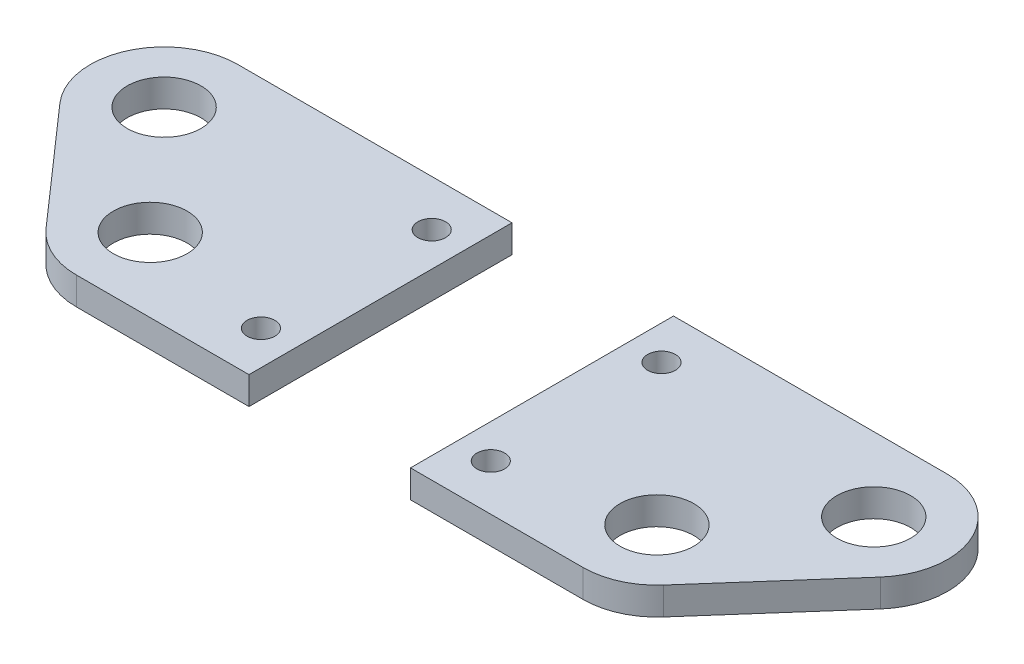
ISO-10303-21;
HEADER;
FILE_DESCRIPTION(('STEP AP214'),'2;1');
FILE_NAME('part.step','',(''),(''),'','','');
FILE_SCHEMA(('AUTOMOTIVE_DESIGN { 1 0 10303 214 1 1 1 1 }'));
ENDSEC;
DATA;
#1=APPLICATION_CONTEXT('core data for automotive mechanical design processes');
#2=APPLICATION_PROTOCOL_DEFINITION('international standard','automotive_design',2000,#1);
#3=PRODUCT_CONTEXT('',#1,'mechanical');
#4=PRODUCT('Part','Part','',(#3));
#5=PRODUCT_RELATED_PRODUCT_CATEGORY('part','',(#4));
#6=PRODUCT_DEFINITION_FORMATION('','',#4);
#7=PRODUCT_DEFINITION_CONTEXT('part definition',#1,'design');
#8=PRODUCT_DEFINITION('design','',#6,#7);
#9=PRODUCT_DEFINITION_SHAPE('','',#8);
#10=(LENGTH_UNIT() NAMED_UNIT(*) SI_UNIT(.MILLI.,.METRE.));
#11=(NAMED_UNIT(*) PLANE_ANGLE_UNIT() SI_UNIT($,.RADIAN.));
#12=(NAMED_UNIT(*) SI_UNIT($,.STERADIAN.) SOLID_ANGLE_UNIT());
#13=UNCERTAINTY_MEASURE_WITH_UNIT(LENGTH_MEASURE(1.E-05),#10,'distance_accuracy_value','');
#14=(GEOMETRIC_REPRESENTATION_CONTEXT(3) GLOBAL_UNCERTAINTY_ASSIGNED_CONTEXT((#13)) GLOBAL_UNIT_ASSIGNED_CONTEXT((#10,
#11,#12)) REPRESENTATION_CONTEXT('',''));
#15=CARTESIAN_POINT('',(0.,0.,0.));
#16=DIRECTION('',(0.,0.,1.));
#17=DIRECTION('',(1.,0.,0.));
#18=AXIS2_PLACEMENT_3D('',#15,#16,#17);
#19=CARTESIAN_POINT('',(27.45,3.,6.24999999999997));
#20=DIRECTION('',(0.,-1.,0.));
#21=DIRECTION('',(0.,0.,-1.));
#22=AXIS2_PLACEMENT_3D('',#19,#20,#21);
#23=CYLINDRICAL_SURFACE('',#22,8.);
#24=CARTESIAN_POINT('',(27.45,0.,6.24999999999997));
#25=DIRECTION('',(0.,1.,0.));
#26=DIRECTION('',(0.,0.,1.));
#27=AXIS2_PLACEMENT_3D('',#24,#25,#26);
#28=CIRCLE('',#27,8.);
#29=CARTESIAN_POINT('',(33.4557081353821,0.,11.5350231591362));
#30=VERTEX_POINT('',#29);
#31=CARTESIAN_POINT('',(27.45,0.,14.25));
#32=VERTEX_POINT('',#31);
#33=EDGE_CURVE('E143',#30,#32,#28,.F.);
#34=ORIENTED_EDGE('',*,*,#33,.F.);
#35=DIRECTION('',(0.,-1.,0.));
#36=VECTOR('',#35,1.);
#37=CARTESIAN_POINT('',(33.4557081353821,3.,11.5350231591362));
#38=LINE('',#37,#36);
#39=CARTESIAN_POINT('',(33.4557081353821,3.,11.5350231591362));
#40=VERTEX_POINT('',#39);
#41=EDGE_CURVE('E12',#40,#30,#38,.T.);
#42=ORIENTED_EDGE('',*,*,#41,.F.);
#43=CARTESIAN_POINT('',(27.45,3.,6.24999999999997));
#44=DIRECTION('',(0.,1.,0.));
#45=DIRECTION('',(0.,0.,1.));
#46=AXIS2_PLACEMENT_3D('',#43,#44,#45);
#47=CIRCLE('',#46,8.);
#48=CARTESIAN_POINT('',(27.45,3.,14.25));
#49=VERTEX_POINT('',#48);
#50=EDGE_CURVE('E350',#40,#49,#47,.F.);
#51=ORIENTED_EDGE('',*,*,#50,.T.);
#52=DIRECTION('',(0.,-1.,0.));
#53=VECTOR('',#52,1.);
#54=CARTESIAN_POINT('',(27.45,3.,14.25));
#55=LINE('',#54,#53);
#56=EDGE_CURVE('E65',#49,#32,#55,.T.);
#57=ORIENTED_EDGE('',*,*,#56,.T.);
#58=EDGE_LOOP('',(#34,#42,#51,#57));
#59=FACE_BOUND('',#58,.T.);
#60=ADVANCED_FACE('F48',(#59),#23,.T.);
#61=CARTESIAN_POINT('',(24.575365484345,3.,21.6263216262237));
#62=DIRECTION('',(-0.750713516922754,0.,-0.660627894892026));
#63=DIRECTION('',(-0.660627894892026,0.,0.750713516922755));
#64=AXIS2_PLACEMENT_3D('',#61,#62,#63);
#65=PLANE('',#64);
#66=DIRECTION('',(0.660627894892026,0.,-0.750713516922754));
#67=VECTOR('',#66,1.);
#68=CARTESIAN_POINT('',(24.575365484345,0.,21.6263216262237));
#69=LINE('',#68,#67);
#70=CARTESIAN_POINT('',(44.4557081353821,0.,-0.964976840863798));
#71=VERTEX_POINT('',#70);
#72=EDGE_CURVE('E140',#30,#71,#69,.T.);
#73=ORIENTED_EDGE('',*,*,#72,.T.);
#74=DIRECTION('',(0.,-1.,0.));
#75=VECTOR('',#74,1.);
#76=CARTESIAN_POINT('',(44.4557081353821,3.,-0.964976840863798));
#77=LINE('',#76,#75);
#78=CARTESIAN_POINT('',(44.4557081353821,3.,-0.964976840863798));
#79=VERTEX_POINT('',#78);
#80=EDGE_CURVE('E57',#79,#71,#77,.T.);
#81=ORIENTED_EDGE('',*,*,#80,.F.);
#82=DIRECTION('',(0.660627894892026,0.,-0.750713516922754));
#83=VECTOR('',#82,1.);
#84=CARTESIAN_POINT('',(24.575365484345,3.,21.6263216262237));
#85=LINE('',#84,#83);
#86=EDGE_CURVE('E352',#40,#79,#85,.T.);
#87=ORIENTED_EDGE('',*,*,#86,.F.);
#88=ORIENTED_EDGE('',*,*,#41,.T.);
#89=EDGE_LOOP('',(#73,#81,#87,#88));
#90=FACE_BOUND('',#89,.T.);
#91=ADVANCED_FACE('F141',(#90),#65,.F.);
#92=CARTESIAN_POINT('',(38.45,3.,-6.25000000000001));
#93=DIRECTION('',(0.,-1.,0.));
#94=DIRECTION('',(0.,0.,-1.));
#95=AXIS2_PLACEMENT_3D('',#92,#93,#94);
#96=CYLINDRICAL_SURFACE('',#95,8.00000000000001);
#97=CARTESIAN_POINT('',(38.45,0.,-6.25000000000001));
#98=DIRECTION('',(0.,1.,0.));
#99=DIRECTION('',(0.,0.,1.));
#100=AXIS2_PLACEMENT_3D('',#97,#98,#99);
#101=CIRCLE('',#100,8.00000000000001);
#102=CARTESIAN_POINT('',(38.45,0.,-14.25));
#103=VERTEX_POINT('',#102);
#104=EDGE_CURVE('E137',#103,#71,#101,.F.);
#105=ORIENTED_EDGE('',*,*,#104,.F.);
#106=DIRECTION('',(0.,-1.,0.));
#107=VECTOR('',#106,1.);
#108=CARTESIAN_POINT('',(38.45,3.,-14.25));
#109=LINE('',#108,#107);
#110=CARTESIAN_POINT('',(38.45,3.,-14.25));
#111=VERTEX_POINT('',#110);
#112=EDGE_CURVE('E126',#111,#103,#109,.T.);
#113=ORIENTED_EDGE('',*,*,#112,.F.);
#114=CARTESIAN_POINT('',(38.45,3.,-6.25000000000001));
#115=DIRECTION('',(0.,1.,0.));
#116=DIRECTION('',(0.,0.,1.));
#117=AXIS2_PLACEMENT_3D('',#114,#115,#116);
#118=CIRCLE('',#117,8.00000000000001);
#119=EDGE_CURVE('E120',#111,#79,#118,.F.);
#120=ORIENTED_EDGE('',*,*,#119,.T.);
#121=ORIENTED_EDGE('',*,*,#80,.T.);
#122=EDGE_LOOP('',(#105,#113,#120,#121));
#123=FACE_BOUND('',#122,.T.);
#124=ADVANCED_FACE('F135',(#123),#96,.T.);
#125=CARTESIAN_POINT('',(0.,3.,-14.25));
#126=DIRECTION('',(0.,0.,1.));
#127=DIRECTION('',(1.,0.,0.));
#128=AXIS2_PLACEMENT_3D('',#125,#126,#127);
#129=PLANE('',#128);
#130=DIRECTION('',(-1.,0.,0.));
#131=VECTOR('',#130,1.);
#132=CARTESIAN_POINT('',(0.,0.,-14.25));
#133=LINE('',#132,#131);
#134=CARTESIAN_POINT('',(8.75,0.,-14.25));
#135=VERTEX_POINT('',#134);
#136=EDGE_CURVE('E125',#103,#135,#133,.T.);
#137=ORIENTED_EDGE('',*,*,#136,.T.);
#138=DIRECTION('',(0.,-1.,0.));
#139=VECTOR('',#138,1.);
#140=CARTESIAN_POINT('',(8.75,3.,-14.25));
#141=LINE('',#140,#139);
#142=CARTESIAN_POINT('',(8.75,3.,-14.25));
#143=VERTEX_POINT('',#142);
#144=EDGE_CURVE('E107',#143,#135,#141,.T.);
#145=ORIENTED_EDGE('',*,*,#144,.F.);
#146=DIRECTION('',(-1.,0.,0.));
#147=VECTOR('',#146,1.);
#148=CARTESIAN_POINT('',(0.,3.,-14.25));
#149=LINE('',#148,#147);
#150=EDGE_CURVE('E112',#111,#143,#149,.T.);
#151=ORIENTED_EDGE('',*,*,#150,.F.);
#152=ORIENTED_EDGE('',*,*,#112,.T.);
#153=EDGE_LOOP('',(#137,#145,#151,#152));
#154=FACE_BOUND('',#153,.T.);
#155=ADVANCED_FACE('F123',(#154),#129,.F.);
#156=CARTESIAN_POINT('',(8.75,3.,0.));
#157=DIRECTION('',(1.,0.,0.));
#158=DIRECTION('',(0.,0.,-1.));
#159=AXIS2_PLACEMENT_3D('',#156,#157,#158);
#160=PLANE('',#159);
#161=DIRECTION('',(0.,0.,1.));
#162=VECTOR('',#161,1.);
#163=CARTESIAN_POINT('',(8.75,0.,0.));
#164=LINE('',#163,#162);
#165=CARTESIAN_POINT('',(8.75,0.,14.25));
#166=VERTEX_POINT('',#165);
#167=EDGE_CURVE('E148',#135,#166,#164,.T.);
#168=ORIENTED_EDGE('',*,*,#167,.T.);
#169=DIRECTION('',(0.,-1.,0.));
#170=VECTOR('',#169,1.);
#171=CARTESIAN_POINT('',(8.75,3.,14.25));
#172=LINE('',#171,#170);
#173=CARTESIAN_POINT('',(8.75,3.,14.25));
#174=VERTEX_POINT('',#173);
#175=EDGE_CURVE('E85',#174,#166,#172,.T.);
#176=ORIENTED_EDGE('',*,*,#175,.F.);
#177=DIRECTION('',(0.,0.,1.));
#178=VECTOR('',#177,1.);
#179=CARTESIAN_POINT('',(8.75,3.,0.));
#180=LINE('',#179,#178);
#181=EDGE_CURVE('E103',#143,#174,#180,.T.);
#182=ORIENTED_EDGE('',*,*,#181,.F.);
#183=ORIENTED_EDGE('',*,*,#144,.T.);
#184=EDGE_LOOP('',(#168,#176,#182,#183));
#185=FACE_BOUND('',#184,.T.);
#186=ADVANCED_FACE('F105',(#185),#160,.F.);
#187=CARTESIAN_POINT('',(0.,3.,14.25));
#188=DIRECTION('',(0.,0.,1.));
#189=DIRECTION('',(1.,0.,0.));
#190=AXIS2_PLACEMENT_3D('',#187,#188,#189);
#191=PLANE('',#190);
#192=DIRECTION('',(-1.,0.,0.));
#193=VECTOR('',#192,1.);
#194=CARTESIAN_POINT('',(0.,0.,14.25));
#195=LINE('',#194,#193);
#196=EDGE_CURVE('E153',#32,#166,#195,.T.);
#197=ORIENTED_EDGE('',*,*,#196,.F.);
#198=ORIENTED_EDGE('',*,*,#56,.F.);
#199=DIRECTION('',(-1.,0.,0.));
#200=VECTOR('',#199,1.);
#201=CARTESIAN_POINT('',(0.,3.,14.25));
#202=LINE('',#201,#200);
#203=EDGE_CURVE('E111',#49,#174,#202,.T.);
#204=ORIENTED_EDGE('',*,*,#203,.T.);
#205=ORIENTED_EDGE('',*,*,#175,.T.);
#206=EDGE_LOOP('',(#197,#198,#204,#205));
#207=FACE_BOUND('',#206,.T.);
#208=ADVANCED_FACE('F168',(#207),#191,.T.);
#209=CARTESIAN_POINT('',(12.45,3.,9.25));
#210=DIRECTION('',(0.,-1.,0.));
#211=DIRECTION('',(0.,0.,-1.));
#212=AXIS2_PLACEMENT_3D('',#209,#210,#211);
#213=CYLINDRICAL_SURFACE('',#212,1.5);
#214=CARTESIAN_POINT('',(12.45,3.,9.25));
#215=DIRECTION('',(0.,1.,0.));
#216=DIRECTION('',(0.,0.,1.));
#217=AXIS2_PLACEMENT_3D('',#214,#215,#216);
#218=CIRCLE('',#217,1.5);
#219=CARTESIAN_POINT('',(12.45,3.,10.75));
#220=VERTEX_POINT('',#219);
#221=EDGE_CURVE('E158',#220,#220,#218,.F.);
#222=ORIENTED_EDGE('',*,*,#221,.F.);
#223=EDGE_LOOP('',(#222));
#224=FACE_BOUND('',#223,.T.);
#225=CARTESIAN_POINT('',(12.45,0.,9.25));
#226=DIRECTION('',(0.,1.,0.));
#227=DIRECTION('',(0.,0.,1.));
#228=AXIS2_PLACEMENT_3D('',#225,#226,#227);
#229=CIRCLE('',#228,1.5);
#230=CARTESIAN_POINT('',(12.45,0.,10.75));
#231=VERTEX_POINT('',#230);
#232=EDGE_CURVE('E165',#231,#231,#229,.F.);
#233=ORIENTED_EDGE('',*,*,#232,.T.);
#234=EDGE_LOOP('',(#233));
#235=FACE_BOUND('',#234,.T.);
#236=ADVANCED_FACE('F50',(#224,#235),#213,.F.);
#237=CARTESIAN_POINT('',(12.45,3.,-9.25));
#238=DIRECTION('',(0.,-1.,0.));
#239=DIRECTION('',(0.,0.,-1.));
#240=AXIS2_PLACEMENT_3D('',#237,#238,#239);
#241=CYLINDRICAL_SURFACE('',#240,1.5);
#242=CARTESIAN_POINT('',(12.45,3.,-9.25));
#243=DIRECTION('',(0.,1.,0.));
#244=DIRECTION('',(0.,0.,1.));
#245=AXIS2_PLACEMENT_3D('',#242,#243,#244);
#246=CIRCLE('',#245,1.5);
#247=CARTESIAN_POINT('',(12.45,3.,-7.75));
#248=VERTEX_POINT('',#247);
#249=EDGE_CURVE('E159',#248,#248,#246,.F.);
#250=ORIENTED_EDGE('',*,*,#249,.F.);
#251=EDGE_LOOP('',(#250));
#252=FACE_BOUND('',#251,.T.);
#253=CARTESIAN_POINT('',(12.45,0.,-9.25));
#254=DIRECTION('',(0.,1.,0.));
#255=DIRECTION('',(0.,0.,1.));
#256=AXIS2_PLACEMENT_3D('',#253,#254,#255);
#257=CIRCLE('',#256,1.5);
#258=CARTESIAN_POINT('',(12.45,0.,-7.75));
#259=VERTEX_POINT('',#258);
#260=EDGE_CURVE('E156',#259,#259,#257,.F.);
#261=ORIENTED_EDGE('',*,*,#260,.T.);
#262=EDGE_LOOP('',(#261));
#263=FACE_BOUND('',#262,.T.);
#264=ADVANCED_FACE('F175',(#252,#263),#241,.F.);
#265=CARTESIAN_POINT('',(0.,3.,0.));
#266=DIRECTION('',(0.,1.,0.));
#267=DIRECTION('',(0.,0.,1.));
#268=AXIS2_PLACEMENT_3D('',#265,#266,#267);
#269=PLANE('',#268);
#270=ORIENTED_EDGE('',*,*,#221,.T.);
#271=EDGE_LOOP('',(#270));
#272=FACE_BOUND('',#271,.T.);
#273=ORIENTED_EDGE('',*,*,#50,.F.);
#274=ORIENTED_EDGE('',*,*,#86,.T.);
#275=ORIENTED_EDGE('',*,*,#119,.F.);
#276=ORIENTED_EDGE('',*,*,#150,.T.);
#277=ORIENTED_EDGE('',*,*,#181,.T.);
#278=ORIENTED_EDGE('',*,*,#203,.F.);
#279=EDGE_LOOP('',(#273,#274,#275,#276,#277,#278));
#280=FACE_BOUND('',#279,.T.);
#281=ORIENTED_EDGE('',*,*,#249,.T.);
#282=EDGE_LOOP('',(#281));
#283=FACE_BOUND('',#282,.T.);
#284=CARTESIAN_POINT('',(38.45,3.,-6.25000000000001));
#285=DIRECTION('',(0.,1.,0.));
#286=DIRECTION('',(0.,0.,1.));
#287=AXIS2_PLACEMENT_3D('',#284,#285,#286);
#288=CIRCLE('',#287,4.00000000000001);
#289=CARTESIAN_POINT('',(38.45,3.,-2.25));
#290=VERTEX_POINT('',#289);
#291=EDGE_CURVE('E341',#290,#290,#288,.T.);
#292=ORIENTED_EDGE('',*,*,#291,.F.);
#293=EDGE_LOOP('',(#292));
#294=FACE_BOUND('',#293,.T.);
#295=CARTESIAN_POINT('',(27.45,3.,6.24999999999997));
#296=DIRECTION('',(0.,1.,0.));
#297=DIRECTION('',(0.,0.,1.));
#298=AXIS2_PLACEMENT_3D('',#295,#296,#297);
#299=CIRCLE('',#298,4.00000000000002);
#300=CARTESIAN_POINT('',(27.45,3.,10.25));
#301=VERTEX_POINT('',#300);
#302=EDGE_CURVE('E338',#301,#301,#299,.T.);
#303=ORIENTED_EDGE('',*,*,#302,.F.);
#304=EDGE_LOOP('',(#303));
#305=FACE_BOUND('',#304,.T.);
#306=ADVANCED_FACE('F117',(#272,#280,#283,#294,#305),#269,.T.);
#307=CARTESIAN_POINT('',(0.,0.,0.));
#308=DIRECTION('',(0.,1.,0.));
#309=DIRECTION('',(0.,0.,1.));
#310=AXIS2_PLACEMENT_3D('',#307,#308,#309);
#311=PLANE('',#310);
#312=ORIENTED_EDGE('',*,*,#232,.F.);
#313=EDGE_LOOP('',(#312));
#314=FACE_BOUND('',#313,.T.);
#315=ORIENTED_EDGE('',*,*,#33,.T.);
#316=ORIENTED_EDGE('',*,*,#196,.T.);
#317=ORIENTED_EDGE('',*,*,#167,.F.);
#318=ORIENTED_EDGE('',*,*,#136,.F.);
#319=ORIENTED_EDGE('',*,*,#104,.T.);
#320=ORIENTED_EDGE('',*,*,#72,.F.);
#321=EDGE_LOOP('',(#315,#316,#317,#318,#319,#320));
#322=FACE_BOUND('',#321,.T.);
#323=ORIENTED_EDGE('',*,*,#260,.F.);
#324=EDGE_LOOP('',(#323));
#325=FACE_BOUND('',#324,.T.);
#326=CARTESIAN_POINT('',(38.45,0.,-6.25000000000001));
#327=DIRECTION('',(0.,1.,0.));
#328=DIRECTION('',(0.,0.,1.));
#329=AXIS2_PLACEMENT_3D('',#326,#327,#328);
#330=CIRCLE('',#329,4.00000000000001);
#331=CARTESIAN_POINT('',(38.45,0.,-2.25));
#332=VERTEX_POINT('',#331);
#333=EDGE_CURVE('E167',#332,#332,#330,.T.);
#334=ORIENTED_EDGE('',*,*,#333,.T.);
#335=EDGE_LOOP('',(#334));
#336=FACE_BOUND('',#335,.T.);
#337=CARTESIAN_POINT('',(27.45,0.,6.24999999999997));
#338=DIRECTION('',(0.,1.,0.));
#339=DIRECTION('',(0.,0.,1.));
#340=AXIS2_PLACEMENT_3D('',#337,#338,#339);
#341=CIRCLE('',#340,4.00000000000002);
#342=CARTESIAN_POINT('',(27.45,0.,10.25));
#343=VERTEX_POINT('',#342);
#344=EDGE_CURVE('E335',#343,#343,#341,.T.);
#345=ORIENTED_EDGE('',*,*,#344,.T.);
#346=EDGE_LOOP('',(#345));
#347=FACE_BOUND('',#346,.T.);
#348=ADVANCED_FACE('F145',(#314,#322,#325,#336,#347),#311,.F.);
#349=CARTESIAN_POINT('',(38.45,0.,-6.25000000000001));
#350=DIRECTION('',(0.,1.,0.));
#351=DIRECTION('',(0.,0.,1.));
#352=AXIS2_PLACEMENT_3D('',#349,#350,#351);
#353=CYLINDRICAL_SURFACE('',#352,4.00000000000001);
#354=ORIENTED_EDGE('',*,*,#333,.F.);
#355=EDGE_LOOP('',(#354));
#356=FACE_BOUND('',#355,.T.);
#357=ORIENTED_EDGE('',*,*,#291,.T.);
#358=EDGE_LOOP('',(#357));
#359=FACE_BOUND('',#358,.T.);
#360=ADVANCED_FACE('F220',(#356,#359),#353,.F.);
#361=CARTESIAN_POINT('',(27.45,0.,6.24999999999997));
#362=DIRECTION('',(0.,1.,0.));
#363=DIRECTION('',(0.,0.,1.));
#364=AXIS2_PLACEMENT_3D('',#361,#362,#363);
#365=CYLINDRICAL_SURFACE('',#364,4.00000000000002);
#366=ORIENTED_EDGE('',*,*,#344,.F.);
#367=EDGE_LOOP('',(#366));
#368=FACE_BOUND('',#367,.T.);
#369=ORIENTED_EDGE('',*,*,#302,.T.);
#370=EDGE_LOOP('',(#369));
#371=FACE_BOUND('',#370,.T.);
#372=ADVANCED_FACE('F228',(#368,#371),#365,.F.);
#373=CLOSED_SHELL('',(#60,#91,#124,#155,#186,#208,#236,#264,#306,#348,#360,#372));
#374=MANIFOLD_SOLID_BREP('B2',#373);
#375=CARTESIAN_POINT('',(0.,3.,-14.25));
#376=DIRECTION('',(0.,0.,-1.));
#377=DIRECTION('',(-1.,0.,0.));
#378=AXIS2_PLACEMENT_3D('',#375,#376,#377);
#379=PLANE('',#378);
#380=DIRECTION('',(1.,0.,0.));
#381=VECTOR('',#380,1.);
#382=CARTESIAN_POINT('',(0.,0.,-14.25));
#383=LINE('',#382,#381);
#384=CARTESIAN_POINT('',(-38.45,0.,-14.25));
#385=VERTEX_POINT('',#384);
#386=CARTESIAN_POINT('',(-8.75,0.,-14.25));
#387=VERTEX_POINT('',#386);
#388=EDGE_CURVE('E462',#385,#387,#383,.T.);
#389=ORIENTED_EDGE('',*,*,#388,.F.);
#390=DIRECTION('',(0.,-1.,0.));
#391=VECTOR('',#390,1.);
#392=CARTESIAN_POINT('',(-38.45,3.,-14.25));
#393=LINE('',#392,#391);
#394=CARTESIAN_POINT('',(-38.45,3.,-14.25));
#395=VERTEX_POINT('',#394);
#396=EDGE_CURVE('E46',#395,#385,#393,.T.);
#397=ORIENTED_EDGE('',*,*,#396,.F.);
#398=DIRECTION('',(1.,0.,0.));
#399=VECTOR('',#398,1.);
#400=CARTESIAN_POINT('',(0.,3.,-14.25));
#401=LINE('',#400,#399);
#402=CARTESIAN_POINT('',(-8.75,3.,-14.25));
#403=VERTEX_POINT('',#402);
#404=EDGE_CURVE('E547',#395,#403,#401,.T.);
#405=ORIENTED_EDGE('',*,*,#404,.T.);
#406=DIRECTION('',(0.,-1.,0.));
#407=VECTOR('',#406,1.);
#408=CARTESIAN_POINT('',(-8.75,3.,-14.25));
#409=LINE('',#408,#407);
#410=EDGE_CURVE('E384',#403,#387,#409,.T.);
#411=ORIENTED_EDGE('',*,*,#410,.T.);
#412=EDGE_LOOP('',(#389,#397,#405,#411));
#413=FACE_BOUND('',#412,.T.);
#414=ADVANCED_FACE('F367',(#413),#379,.T.);
#415=CARTESIAN_POINT('',(-38.45,3.,-6.25));
#416=DIRECTION('',(0.,-1.,0.));
#417=DIRECTION('',(0.,0.,-1.));
#418=AXIS2_PLACEMENT_3D('',#415,#416,#417);
#419=CYLINDRICAL_SURFACE('',#418,8.00000000000001);
#420=CARTESIAN_POINT('',(-38.45,0.,-6.25));
#421=DIRECTION('',(0.,1.,0.));
#422=DIRECTION('',(0.,0.,1.));
#423=AXIS2_PLACEMENT_3D('',#420,#421,#422);
#424=CIRCLE('',#423,8.00000000000001);
#425=CARTESIAN_POINT('',(-44.4557081353821,0.,-0.964976840863788));
#426=VERTEX_POINT('',#425);
#427=EDGE_CURVE('E459',#385,#426,#424,.T.);
#428=ORIENTED_EDGE('',*,*,#427,.T.);
#429=DIRECTION('',(0.,-1.,0.));
#430=VECTOR('',#429,1.);
#431=CARTESIAN_POINT('',(-44.4557081353821,3.,-0.964976840863788));
#432=LINE('',#431,#430);
#433=CARTESIAN_POINT('',(-44.4557081353821,3.,-0.964976840863788));
#434=VERTEX_POINT('',#433);
#435=EDGE_CURVE('E376',#434,#426,#432,.T.);
#436=ORIENTED_EDGE('',*,*,#435,.F.);
#437=CARTESIAN_POINT('',(-38.45,3.,-6.25));
#438=DIRECTION('',(0.,1.,0.));
#439=DIRECTION('',(0.,0.,1.));
#440=AXIS2_PLACEMENT_3D('',#437,#438,#439);
#441=CIRCLE('',#440,8.00000000000001);
#442=EDGE_CURVE('E549',#395,#434,#441,.T.);
#443=ORIENTED_EDGE('',*,*,#442,.F.);
#444=ORIENTED_EDGE('',*,*,#396,.T.);
#445=EDGE_LOOP('',(#428,#436,#443,#444));
#446=FACE_BOUND('',#445,.T.);
#447=ADVANCED_FACE('F460',(#446),#419,.T.);
#448=CARTESIAN_POINT('',(-24.575365484345,3.,21.6263216262237));
#449=DIRECTION('',(-0.750713516922754,0.,0.660627894892026));
#450=DIRECTION('',(0.660627894892026,0.,0.750713516922754));
#451=AXIS2_PLACEMENT_3D('',#448,#449,#450);
#452=PLANE('',#451);
#453=DIRECTION('',(-0.660627894892026,0.,-0.750713516922754));
#454=VECTOR('',#453,1.);
#455=CARTESIAN_POINT('',(-24.575365484345,0.,21.6263216262237));
#456=LINE('',#455,#454);
#457=CARTESIAN_POINT('',(-33.4557081353821,0.,11.5350231591362));
#458=VERTEX_POINT('',#457);
#459=EDGE_CURVE('E456',#458,#426,#456,.T.);
#460=ORIENTED_EDGE('',*,*,#459,.F.);
#461=DIRECTION('',(0.,-1.,0.));
#462=VECTOR('',#461,1.);
#463=CARTESIAN_POINT('',(-33.4557081353821,3.,11.5350231591362));
#464=LINE('',#463,#462);
#465=CARTESIAN_POINT('',(-33.4557081353821,3.,11.5350231591362));
#466=VERTEX_POINT('',#465);
#467=EDGE_CURVE('E445',#466,#458,#464,.T.);
#468=ORIENTED_EDGE('',*,*,#467,.F.);
#469=DIRECTION('',(-0.660627894892026,0.,-0.750713516922754));
#470=VECTOR('',#469,1.);
#471=CARTESIAN_POINT('',(-24.575365484345,3.,21.6263216262237));
#472=LINE('',#471,#470);
#473=EDGE_CURVE('E439',#466,#434,#472,.T.);
#474=ORIENTED_EDGE('',*,*,#473,.T.);
#475=ORIENTED_EDGE('',*,*,#435,.T.);
#476=EDGE_LOOP('',(#460,#468,#474,#475));
#477=FACE_BOUND('',#476,.T.);
#478=ADVANCED_FACE('F454',(#477),#452,.T.);
#479=CARTESIAN_POINT('',(-27.45,3.,6.24999999999997));
#480=DIRECTION('',(0.,-1.,0.));
#481=DIRECTION('',(0.,0.,-1.));
#482=AXIS2_PLACEMENT_3D('',#479,#480,#481);
#483=CYLINDRICAL_SURFACE('',#482,8.00000000000001);
#484=CARTESIAN_POINT('',(-27.45,0.,6.24999999999997));
#485=DIRECTION('',(0.,1.,0.));
#486=DIRECTION('',(0.,0.,1.));
#487=AXIS2_PLACEMENT_3D('',#484,#485,#486);
#488=CIRCLE('',#487,8.00000000000001);
#489=CARTESIAN_POINT('',(-27.45,0.,14.25));
#490=VERTEX_POINT('',#489);
#491=EDGE_CURVE('E444',#458,#490,#488,.T.);
#492=ORIENTED_EDGE('',*,*,#491,.T.);
#493=DIRECTION('',(0.,-1.,0.));
#494=VECTOR('',#493,1.);
#495=CARTESIAN_POINT('',(-27.45,3.,14.25));
#496=LINE('',#495,#494);
#497=CARTESIAN_POINT('',(-27.45,3.,14.25));
#498=VERTEX_POINT('',#497);
#499=EDGE_CURVE('E426',#498,#490,#496,.T.);
#500=ORIENTED_EDGE('',*,*,#499,.F.);
#501=CARTESIAN_POINT('',(-27.45,3.,6.24999999999997));
#502=DIRECTION('',(0.,1.,0.));
#503=DIRECTION('',(0.,0.,1.));
#504=AXIS2_PLACEMENT_3D('',#501,#502,#503);
#505=CIRCLE('',#504,8.00000000000001);
#506=EDGE_CURVE('E431',#466,#498,#505,.T.);
#507=ORIENTED_EDGE('',*,*,#506,.F.);
#508=ORIENTED_EDGE('',*,*,#467,.T.);
#509=EDGE_LOOP('',(#492,#500,#507,#508));
#510=FACE_BOUND('',#509,.T.);
#511=ADVANCED_FACE('F442',(#510),#483,.T.);
#512=CARTESIAN_POINT('',(0.,3.,14.25));
#513=DIRECTION('',(0.,0.,-1.));
#514=DIRECTION('',(-1.,0.,0.));
#515=AXIS2_PLACEMENT_3D('',#512,#513,#514);
#516=PLANE('',#515);
#517=DIRECTION('',(1.,0.,0.));
#518=VECTOR('',#517,1.);
#519=CARTESIAN_POINT('',(0.,0.,14.25));
#520=LINE('',#519,#518);
#521=CARTESIAN_POINT('',(-8.75,0.,14.25));
#522=VERTEX_POINT('',#521);
#523=EDGE_CURVE('E467',#490,#522,#520,.T.);
#524=ORIENTED_EDGE('',*,*,#523,.T.);
#525=DIRECTION('',(0.,-1.,0.));
#526=VECTOR('',#525,1.);
#527=CARTESIAN_POINT('',(-8.75,3.,14.25));
#528=LINE('',#527,#526);
#529=CARTESIAN_POINT('',(-8.75,3.,14.25));
#530=VERTEX_POINT('',#529);
#531=EDGE_CURVE('E404',#530,#522,#528,.T.);
#532=ORIENTED_EDGE('',*,*,#531,.F.);
#533=DIRECTION('',(1.,0.,0.));
#534=VECTOR('',#533,1.);
#535=CARTESIAN_POINT('',(0.,3.,14.25));
#536=LINE('',#535,#534);
#537=EDGE_CURVE('E422',#498,#530,#536,.T.);
#538=ORIENTED_EDGE('',*,*,#537,.F.);
#539=ORIENTED_EDGE('',*,*,#499,.T.);
#540=EDGE_LOOP('',(#524,#532,#538,#539));
#541=FACE_BOUND('',#540,.T.);
#542=ADVANCED_FACE('F424',(#541),#516,.F.);
#543=CARTESIAN_POINT('',(-12.45,3.,-9.25));
#544=DIRECTION('',(0.,-1.,0.));
#545=DIRECTION('',(0.,0.,-1.));
#546=AXIS2_PLACEMENT_3D('',#543,#544,#545);
#547=CYLINDRICAL_SURFACE('',#546,1.5);
#548=CARTESIAN_POINT('',(-12.45,3.,-9.25));
#549=DIRECTION('',(0.,1.,0.));
#550=DIRECTION('',(0.,0.,1.));
#551=AXIS2_PLACEMENT_3D('',#548,#549,#550);
#552=CIRCLE('',#551,1.5);
#553=CARTESIAN_POINT('',(-12.45,3.,-7.75));
#554=VERTEX_POINT('',#553);
#555=EDGE_CURVE('E511',#554,#554,#552,.T.);
#556=ORIENTED_EDGE('',*,*,#555,.T.);
#557=EDGE_LOOP('',(#556));
#558=FACE_BOUND('',#557,.T.);
#559=CARTESIAN_POINT('',(-12.45,0.,-9.25));
#560=DIRECTION('',(0.,1.,0.));
#561=DIRECTION('',(0.,0.,1.));
#562=AXIS2_PLACEMENT_3D('',#559,#560,#561);
#563=CIRCLE('',#562,1.5);
#564=CARTESIAN_POINT('',(-12.45,0.,-7.75));
#565=VERTEX_POINT('',#564);
#566=EDGE_CURVE('E480',#565,#565,#563,.T.);
#567=ORIENTED_EDGE('',*,*,#566,.F.);
#568=EDGE_LOOP('',(#567));
#569=FACE_BOUND('',#568,.T.);
#570=ADVANCED_FACE('F492',(#558,#569),#547,.F.);
#571=CARTESIAN_POINT('',(-12.45,3.,9.25));
#572=DIRECTION('',(0.,-1.,0.));
#573=DIRECTION('',(0.,0.,-1.));
#574=AXIS2_PLACEMENT_3D('',#571,#572,#573);
#575=CYLINDRICAL_SURFACE('',#574,1.5);
#576=CARTESIAN_POINT('',(-12.45,3.,9.25));
#577=DIRECTION('',(0.,1.,0.));
#578=DIRECTION('',(0.,0.,1.));
#579=AXIS2_PLACEMENT_3D('',#576,#577,#578);
#580=CIRCLE('',#579,1.5);
#581=CARTESIAN_POINT('',(-12.45,3.,10.75));
#582=VERTEX_POINT('',#581);
#583=EDGE_CURVE('E474',#582,#582,#580,.T.);
#584=ORIENTED_EDGE('',*,*,#583,.T.);
#585=EDGE_LOOP('',(#584));
#586=FACE_BOUND('',#585,.T.);
#587=CARTESIAN_POINT('',(-12.45,0.,9.25));
#588=DIRECTION('',(0.,1.,0.));
#589=DIRECTION('',(0.,0.,1.));
#590=AXIS2_PLACEMENT_3D('',#587,#588,#589);
#591=CIRCLE('',#590,1.5);
#592=CARTESIAN_POINT('',(-12.45,0.,10.75));
#593=VERTEX_POINT('',#592);
#594=EDGE_CURVE('E477',#593,#593,#591,.T.);
#595=ORIENTED_EDGE('',*,*,#594,.F.);
#596=EDGE_LOOP('',(#595));
#597=FACE_BOUND('',#596,.T.);
#598=ADVANCED_FACE('F369',(#586,#597),#575,.F.);
#599=CARTESIAN_POINT('',(-8.75,3.,0.));
#600=DIRECTION('',(1.,0.,0.));
#601=DIRECTION('',(0.,0.,-1.));
#602=AXIS2_PLACEMENT_3D('',#599,#600,#601);
#603=PLANE('',#602);
#604=DIRECTION('',(0.,0.,1.));
#605=VECTOR('',#604,1.);
#606=CARTESIAN_POINT('',(-8.75,0.,0.));
#607=LINE('',#606,#605);
#608=EDGE_CURVE('E472',#387,#522,#607,.T.);
#609=ORIENTED_EDGE('',*,*,#608,.F.);
#610=ORIENTED_EDGE('',*,*,#410,.F.);
#611=DIRECTION('',(0.,0.,1.));
#612=VECTOR('',#611,1.);
#613=CARTESIAN_POINT('',(-8.75,3.,0.));
#614=LINE('',#613,#612);
#615=EDGE_CURVE('E430',#403,#530,#614,.T.);
#616=ORIENTED_EDGE('',*,*,#615,.T.);
#617=ORIENTED_EDGE('',*,*,#531,.T.);
#618=EDGE_LOOP('',(#609,#610,#616,#617));
#619=FACE_BOUND('',#618,.T.);
#620=ADVANCED_FACE('F483',(#619),#603,.T.);
#621=CARTESIAN_POINT('',(0.,3.,0.));
#622=DIRECTION('',(0.,1.,0.));
#623=DIRECTION('',(0.,0.,1.));
#624=AXIS2_PLACEMENT_3D('',#621,#622,#623);
#625=PLANE('',#624);
#626=ORIENTED_EDGE('',*,*,#583,.F.);
#627=EDGE_LOOP('',(#626));
#628=FACE_BOUND('',#627,.T.);
#629=ORIENTED_EDGE('',*,*,#555,.F.);
#630=EDGE_LOOP('',(#629));
#631=FACE_BOUND('',#630,.T.);
#632=ORIENTED_EDGE('',*,*,#404,.F.);
#633=ORIENTED_EDGE('',*,*,#442,.T.);
#634=ORIENTED_EDGE('',*,*,#473,.F.);
#635=ORIENTED_EDGE('',*,*,#506,.T.);
#636=ORIENTED_EDGE('',*,*,#537,.T.);
#637=ORIENTED_EDGE('',*,*,#615,.F.);
#638=EDGE_LOOP('',(#632,#633,#634,#635,#636,#637));
#639=FACE_BOUND('',#638,.T.);
#640=CARTESIAN_POINT('',(-38.45,3.,-6.25));
#641=DIRECTION('',(0.,1.,0.));
#642=DIRECTION('',(0.,0.,1.));
#643=AXIS2_PLACEMENT_3D('',#640,#641,#642);
#644=CIRCLE('',#643,4.00000000000001);
#645=CARTESIAN_POINT('',(-38.45,3.,-2.24999999999999));
#646=VERTEX_POINT('',#645);
#647=EDGE_CURVE('E537',#646,#646,#644,.T.);
#648=ORIENTED_EDGE('',*,*,#647,.F.);
#649=EDGE_LOOP('',(#648));
#650=FACE_BOUND('',#649,.T.);
#651=CARTESIAN_POINT('',(-27.45,3.,6.24999999999997));
#652=DIRECTION('',(0.,1.,0.));
#653=DIRECTION('',(0.,0.,1.));
#654=AXIS2_PLACEMENT_3D('',#651,#652,#653);
#655=CIRCLE('',#654,4.00000000000003);
#656=CARTESIAN_POINT('',(-27.45,3.,10.25));
#657=VERTEX_POINT('',#656);
#658=EDGE_CURVE('E534',#657,#657,#655,.T.);
#659=ORIENTED_EDGE('',*,*,#658,.F.);
#660=EDGE_LOOP('',(#659));
#661=FACE_BOUND('',#660,.T.);
#662=ADVANCED_FACE('F436',(#628,#631,#639,#650,#661),#625,.T.);
#663=CARTESIAN_POINT('',(0.,0.,0.));
#664=DIRECTION('',(0.,1.,0.));
#665=DIRECTION('',(0.,0.,1.));
#666=AXIS2_PLACEMENT_3D('',#663,#664,#665);
#667=PLANE('',#666);
#668=ORIENTED_EDGE('',*,*,#594,.T.);
#669=EDGE_LOOP('',(#668));
#670=FACE_BOUND('',#669,.T.);
#671=ORIENTED_EDGE('',*,*,#566,.T.);
#672=EDGE_LOOP('',(#671));
#673=FACE_BOUND('',#672,.T.);
#674=ORIENTED_EDGE('',*,*,#388,.T.);
#675=ORIENTED_EDGE('',*,*,#608,.T.);
#676=ORIENTED_EDGE('',*,*,#523,.F.);
#677=ORIENTED_EDGE('',*,*,#491,.F.);
#678=ORIENTED_EDGE('',*,*,#459,.T.);
#679=ORIENTED_EDGE('',*,*,#427,.F.);
#680=EDGE_LOOP('',(#674,#675,#676,#677,#678,#679));
#681=FACE_BOUND('',#680,.T.);
#682=CARTESIAN_POINT('',(-38.45,0.,-6.25));
#683=DIRECTION('',(0.,1.,0.));
#684=DIRECTION('',(0.,0.,1.));
#685=AXIS2_PLACEMENT_3D('',#682,#683,#684);
#686=CIRCLE('',#685,4.00000000000001);
#687=CARTESIAN_POINT('',(-38.45,0.,-2.24999999999999));
#688=VERTEX_POINT('',#687);
#689=EDGE_CURVE('E481',#688,#688,#686,.T.);
#690=ORIENTED_EDGE('',*,*,#689,.T.);
#691=EDGE_LOOP('',(#690));
#692=FACE_BOUND('',#691,.T.);
#693=CARTESIAN_POINT('',(-27.45,0.,6.24999999999997));
#694=DIRECTION('',(0.,1.,0.));
#695=DIRECTION('',(0.,0.,1.));
#696=AXIS2_PLACEMENT_3D('',#693,#694,#695);
#697=CIRCLE('',#696,4.00000000000003);
#698=CARTESIAN_POINT('',(-27.45,0.,10.25));
#699=VERTEX_POINT('',#698);
#700=EDGE_CURVE('E531',#699,#699,#697,.T.);
#701=ORIENTED_EDGE('',*,*,#700,.T.);
#702=EDGE_LOOP('',(#701));
#703=FACE_BOUND('',#702,.T.);
#704=ADVANCED_FACE('F464',(#670,#673,#681,#692,#703),#667,.F.);
#705=CARTESIAN_POINT('',(-38.45,0.,-6.25));
#706=DIRECTION('',(0.,1.,0.));
#707=DIRECTION('',(0.,0.,1.));
#708=AXIS2_PLACEMENT_3D('',#705,#706,#707);
#709=CYLINDRICAL_SURFACE('',#708,4.00000000000001);
#710=ORIENTED_EDGE('',*,*,#689,.F.);
#711=EDGE_LOOP('',(#710));
#712=FACE_BOUND('',#711,.T.);
#713=ORIENTED_EDGE('',*,*,#647,.T.);
#714=EDGE_LOOP('',(#713));
#715=FACE_BOUND('',#714,.T.);
#716=ADVANCED_FACE('F515',(#712,#715),#709,.F.);
#717=CARTESIAN_POINT('',(-27.45,0.,6.24999999999997));
#718=DIRECTION('',(0.,1.,0.));
#719=DIRECTION('',(0.,0.,1.));
#720=AXIS2_PLACEMENT_3D('',#717,#718,#719);
#721=CYLINDRICAL_SURFACE('',#720,4.00000000000003);
#722=ORIENTED_EDGE('',*,*,#700,.F.);
#723=EDGE_LOOP('',(#722));
#724=FACE_BOUND('',#723,.T.);
#725=ORIENTED_EDGE('',*,*,#658,.T.);
#726=EDGE_LOOP('',(#725));
#727=FACE_BOUND('',#726,.T.);
#728=ADVANCED_FACE('F520',(#724,#727),#721,.F.);
#729=CLOSED_SHELL('',(#414,#447,#478,#511,#542,#570,#598,#620,#662,#704,#716,#728));
#730=MANIFOLD_SOLID_BREP('B6',#729);
#731=ADVANCED_BREP_SHAPE_REPRESENTATION('',(#18,#374,#730),#14);
#732=SHAPE_DEFINITION_REPRESENTATION(#9,#731);
ENDSEC;
END-ISO-10303-21;
